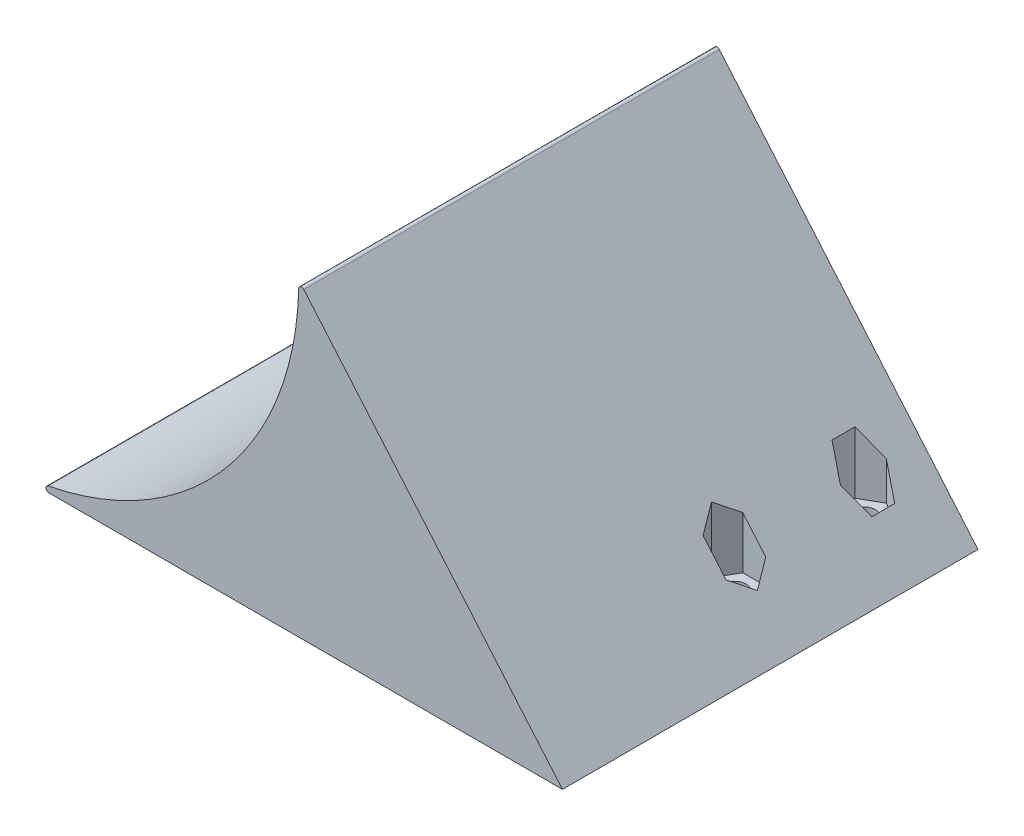
ISO-10303-21;
HEADER;
FILE_DESCRIPTION(('STEP AP214'),'2;1');
FILE_NAME('part.step','',(''),(''),'','','');
FILE_SCHEMA(('AUTOMOTIVE_DESIGN { 1 0 10303 214 1 1 1 1 }'));
ENDSEC;
DATA;
#1=APPLICATION_CONTEXT('core data for automotive mechanical design processes');
#2=APPLICATION_PROTOCOL_DEFINITION('international standard','automotive_design',2000,#1);
#3=PRODUCT_CONTEXT('',#1,'mechanical');
#4=PRODUCT('Part','Part','',(#3));
#5=PRODUCT_RELATED_PRODUCT_CATEGORY('part','',(#4));
#6=PRODUCT_DEFINITION_FORMATION('','',#4);
#7=PRODUCT_DEFINITION_CONTEXT('part definition',#1,'design');
#8=PRODUCT_DEFINITION('design','',#6,#7);
#9=PRODUCT_DEFINITION_SHAPE('','',#8);
#10=(LENGTH_UNIT() NAMED_UNIT(*) SI_UNIT(.MILLI.,.METRE.));
#11=(NAMED_UNIT(*) PLANE_ANGLE_UNIT() SI_UNIT($,.RADIAN.));
#12=(NAMED_UNIT(*) SI_UNIT($,.STERADIAN.) SOLID_ANGLE_UNIT());
#13=UNCERTAINTY_MEASURE_WITH_UNIT(LENGTH_MEASURE(1.E-05),#10,'distance_accuracy_value','');
#14=(GEOMETRIC_REPRESENTATION_CONTEXT(3) GLOBAL_UNCERTAINTY_ASSIGNED_CONTEXT((#13)) GLOBAL_UNIT_ASSIGNED_CONTEXT((#10,
#11,#12)) REPRESENTATION_CONTEXT('',''));
#15=CARTESIAN_POINT('',(0.,0.,0.));
#16=DIRECTION('',(0.,0.,1.));
#17=DIRECTION('',(1.,0.,0.));
#18=AXIS2_PLACEMENT_3D('',#15,#16,#17);
#19=CARTESIAN_POINT('',(0.,-54.,72.5));
#20=DIRECTION('',(0.,-1.,0.));
#21=DIRECTION('',(1.,0.,0.));
#22=AXIS2_PLACEMENT_3D('',#19,#20,#21);
#23=PLANE('',#22);
#24=CARTESIAN_POINT('',(29.8923048454133,-54.,-62.5));
#25=DIRECTION('',(0.,-1.,0.));
#26=DIRECTION('',(1.,0.,0.));
#27=AXIS2_PLACEMENT_3D('',#24,#25,#26);
#28=CIRCLE('',#27,2.04999999999999);
#29=CARTESIAN_POINT('',(31.9423048454133,-54.,-62.5));
#30=VERTEX_POINT('',#29);
#31=EDGE_CURVE('E424',#30,#30,#28,.T.);
#32=ORIENTED_EDGE('',*,*,#31,.F.);
#33=EDGE_LOOP('',(#32));
#34=FACE_BOUND('',#33,.T.);
#35=CARTESIAN_POINT('',(90.,-54.,-62.5));
#36=DIRECTION('',(0.,1.,0.));
#37=DIRECTION('',(-1.,0.,0.));
#38=AXIS2_PLACEMENT_3D('',#35,#36,#37);
#39=CIRCLE('',#38,2.04999999999999);
#40=CARTESIAN_POINT('',(87.95,-54.,-62.5));
#41=VERTEX_POINT('',#40);
#42=EDGE_CURVE('E416',#41,#41,#39,.T.);
#43=ORIENTED_EDGE('',*,*,#42,.T.);
#44=EDGE_LOOP('',(#43));
#45=FACE_BOUND('',#44,.T.);
#46=CARTESIAN_POINT('',(90.,-54.,-40.));
#47=DIRECTION('',(0.,1.,0.));
#48=DIRECTION('',(-1.,0.,0.));
#49=AXIS2_PLACEMENT_3D('',#46,#47,#48);
#50=CIRCLE('',#49,2.04999999999999);
#51=CARTESIAN_POINT('',(87.95,-54.,-40.));
#52=VERTEX_POINT('',#51);
#53=EDGE_CURVE('E433',#52,#52,#50,.T.);
#54=ORIENTED_EDGE('',*,*,#53,.T.);
#55=EDGE_LOOP('',(#54));
#56=FACE_BOUND('',#55,.T.);
#57=DIRECTION('',(0.,0.,-1.));
#58=VECTOR('',#57,1.);
#59=CARTESIAN_POINT('',(100.,-54.,72.5));
#60=LINE('',#59,#58);
#61=CARTESIAN_POINT('',(100.,-54.,0.));
#62=VERTEX_POINT('',#61);
#63=CARTESIAN_POINT('',(100.,-54.,-72.5));
#64=VERTEX_POINT('',#63);
#65=EDGE_CURVE('E207',#62,#64,#60,.T.);
#66=ORIENTED_EDGE('',*,*,#65,.F.);
#67=DIRECTION('',(-1.,0.,0.));
#68=VECTOR('',#67,1.);
#69=CARTESIAN_POINT('',(0.,-54.,0.));
#70=LINE('',#69,#68);
#71=CARTESIAN_POINT('',(10.3923048454133,-54.,0.));
#72=VERTEX_POINT('',#71);
#73=EDGE_CURVE('E196',#62,#72,#70,.T.);
#74=ORIENTED_EDGE('',*,*,#73,.T.);
#75=DIRECTION('',(0.,0.,-1.));
#76=VECTOR('',#75,1.);
#77=CARTESIAN_POINT('',(10.3923048454133,-54.,72.5));
#78=LINE('',#77,#76);
#79=CARTESIAN_POINT('',(10.3923048454133,-54.,-72.5));
#80=VERTEX_POINT('',#79);
#81=EDGE_CURVE('E205',#72,#80,#78,.T.);
#82=ORIENTED_EDGE('',*,*,#81,.T.);
#83=DIRECTION('',(-1.,0.,0.));
#84=VECTOR('',#83,1.);
#85=CARTESIAN_POINT('',(0.,-54.,-72.5));
#86=LINE('',#85,#84);
#87=EDGE_CURVE('E383',#64,#80,#86,.T.);
#88=ORIENTED_EDGE('',*,*,#87,.F.);
#89=EDGE_LOOP('',(#66,#74,#82,#88));
#90=FACE_BOUND('',#89,.T.);
#91=ADVANCED_FACE('F42',(#34,#45,#56,#90),#23,.T.);
#92=CARTESIAN_POINT('',(0.,0.,72.5));
#93=DIRECTION('',(0.,0.,-1.));
#94=DIRECTION('',(-1.,0.,0.));
#95=AXIS2_PLACEMENT_3D('',#92,#93,#94);
#96=CYLINDRICAL_SURFACE('',#95,54.);
#97=CARTESIAN_POINT('',(0.,0.,-83.7583302491976));
#98=DIRECTION('',(0.499999999999997,0.,-0.86602540378444));
#99=DIRECTION('',(-0.866025403784441,0.,-0.499999999999997));
#100=AXIS2_PLACEMENT_3D('',#97,#98,#99);
#101=ELLIPSE('',#100,62.3538290724794,54.);
#102=CARTESIAN_POINT('',(33.356406460551,-42.4658703906856,-64.5));
#103=VERTEX_POINT('',#102);
#104=CARTESIAN_POINT('',(29.8923048454133,-44.9716589757247,-66.5));
#105=VERTEX_POINT('',#104);
#106=EDGE_CURVE('E51',#103,#105,#101,.T.);
#107=ORIENTED_EDGE('',*,*,#106,.F.);
#108=DIRECTION('',(0.,0.,-1.));
#109=VECTOR('',#108,1.);
#110=CARTESIAN_POINT('',(33.356406460551,-42.4658703906856,72.5));
#111=LINE('',#110,#109);
#112=CARTESIAN_POINT('',(33.356406460551,-42.4658703906856,-60.5));
#113=VERTEX_POINT('',#112);
#114=EDGE_CURVE('E260',#113,#103,#111,.T.);
#115=ORIENTED_EDGE('',*,*,#114,.F.);
#116=CARTESIAN_POINT('',(0.,0.,-41.2416697508023));
#117=DIRECTION('',(0.5,0.,0.866025403784439));
#118=DIRECTION('',(0.866025403784439,0.,-0.5));
#119=AXIS2_PLACEMENT_3D('',#116,#117,#118);
#120=ELLIPSE('',#119,62.3538290724796,54.);
#121=CARTESIAN_POINT('',(29.8923048454133,-44.9716589757247,-58.5));
#122=VERTEX_POINT('',#121);
#123=EDGE_CURVE('E263',#122,#113,#120,.T.);
#124=ORIENTED_EDGE('',*,*,#123,.F.);
#125=CARTESIAN_POINT('',(0.,0.,-75.7583302491976));
#126=DIRECTION('',(-0.499999999999998,0.,0.86602540378444));
#127=DIRECTION('',(-0.86602540378444,0.,-0.499999999999998));
#128=AXIS2_PLACEMENT_3D('',#125,#126,#127);
#129=ELLIPSE('',#128,62.3538290724795,54.);
#130=CARTESIAN_POINT('',(26.4282032302755,-47.0908703892724,-60.5));
#131=VERTEX_POINT('',#130);
#132=EDGE_CURVE('E266',#131,#122,#129,.T.);
#133=ORIENTED_EDGE('',*,*,#132,.F.);
#134=DIRECTION('',(0.,0.,-1.));
#135=VECTOR('',#134,1.);
#136=CARTESIAN_POINT('',(26.4282032302753,-47.0908703892726,72.5));
#137=LINE('',#136,#135);
#138=CARTESIAN_POINT('',(26.4282032302755,-47.0908703892726,-64.5));
#139=VERTEX_POINT('',#138);
#140=EDGE_CURVE('E269',#139,#131,#137,.F.);
#141=ORIENTED_EDGE('',*,*,#140,.F.);
#142=CARTESIAN_POINT('',(0.,0.,-49.2416697508023));
#143=DIRECTION('',(-0.500000000000001,0.,-0.866025403784438));
#144=DIRECTION('',(0.866025403784438,0.,-0.500000000000001));
#145=AXIS2_PLACEMENT_3D('',#142,#143,#144);
#146=ELLIPSE('',#145,62.3538290724796,54.);
#147=EDGE_CURVE('E272',#105,#139,#146,.T.);
#148=ORIENTED_EDGE('',*,*,#147,.F.);
#149=EDGE_LOOP('',(#107,#115,#124,#133,#141,#148));
#150=FACE_BOUND('',#149,.T.);
#151=DIRECTION('',(0.,0.,-1.));
#152=VECTOR('',#151,1.);
#153=CARTESIAN_POINT('',(10.2969625991251,-53.0091743119266,72.5));
#154=LINE('',#153,#152);
#155=CARTESIAN_POINT('',(10.2969625991251,-53.0091743119266,-72.5));
#156=VERTEX_POINT('',#155);
#157=CARTESIAN_POINT('',(10.2969625991251,-53.0091743119266,0.));
#158=VERTEX_POINT('',#157);
#159=EDGE_CURVE('E392',#156,#158,#154,.F.);
#160=ORIENTED_EDGE('',*,*,#159,.T.);
#161=CARTESIAN_POINT('',(0.,0.,0.));
#162=DIRECTION('',(0.,0.,1.));
#163=DIRECTION('',(1.,0.,0.));
#164=AXIS2_PLACEMENT_3D('',#161,#162,#163);
#165=CIRCLE('',#164,54.);
#166=CARTESIAN_POINT('',(53.9837068706725,-1.32642093669479,0.));
#167=VERTEX_POINT('',#166);
#168=EDGE_CURVE('E58',#158,#167,#165,.T.);
#169=ORIENTED_EDGE('',*,*,#168,.T.);
#170=DIRECTION('',(0.,0.,-1.));
#171=VECTOR('',#170,1.);
#172=CARTESIAN_POINT('',(53.9837068706725,-1.32642093669479,72.5));
#173=LINE('',#172,#171);
#174=CARTESIAN_POINT('',(53.9837068706725,-1.32642093669479,-72.5));
#175=VERTEX_POINT('',#174);
#176=EDGE_CURVE('E395',#167,#175,#173,.T.);
#177=ORIENTED_EDGE('',*,*,#176,.T.);
#178=CARTESIAN_POINT('',(0.,0.,-72.5));
#179=DIRECTION('',(0.,0.,1.));
#180=DIRECTION('',(1.,0.,0.));
#181=AXIS2_PLACEMENT_3D('',#178,#179,#180);
#182=CIRCLE('',#181,54.);
#183=EDGE_CURVE('E330',#156,#175,#182,.T.);
#184=ORIENTED_EDGE('',*,*,#183,.F.);
#185=EDGE_LOOP('',(#160,#169,#177,#184));
#186=FACE_BOUND('',#185,.T.);
#187=ADVANCED_FACE('F298',(#150,#186),#96,.F.);
#188=CARTESIAN_POINT('',(31.2925278219396,26.6565977742448,72.5));
#189=DIRECTION('',(0.761243230486711,0.648466455599791,0.));
#190=DIRECTION('',(-0.648466455599791,0.761243230486711,0.));
#191=AXIS2_PLACEMENT_3D('',#188,#189,#190);
#192=PLANE('',#191);
#193=DIRECTION('',(-0.431207891910267,0.506200568764226,-0.746873977413243));
#194=VECTOR('',#193,1.);
#195=CARTESIAN_POINT('',(102.503575987853,-56.9389805074797,-25.2713743430158));
#196=LINE('',#195,#194);
#197=CARTESIAN_POINT('',(94.,-46.9565217391304,-40.));
#198=VERTEX_POINT('',#197);
#199=CARTESIAN_POINT('',(92.,-44.6086956521739,-43.4641016151377));
#200=VERTEX_POINT('',#199);
#201=EDGE_CURVE('E238',#198,#200,#196,.T.);
#202=ORIENTED_EDGE('',*,*,#201,.F.);
#203=DIRECTION('',(0.431207891910267,-0.506200568764227,-0.746873977413242));
#204=VECTOR('',#203,1.);
#205=CARTESIAN_POINT('',(30.0405364901778,28.1263267289217,70.7810404238582));
#206=LINE('',#205,#204);
#207=CARTESIAN_POINT('',(92.,-44.6086956521739,-36.5358983848623));
#208=VERTEX_POINT('',#207);
#209=EDGE_CURVE('E214',#208,#198,#206,.T.);
#210=ORIENTED_EDGE('',*,*,#209,.F.);
#211=DIRECTION('',(0.648466455599791,-0.761243230486711,0.));
#212=VECTOR('',#211,1.);
#213=CARTESIAN_POINT('',(31.2925278219396,26.6565977742448,-36.5358983848623));
#214=LINE('',#213,#212);
#215=CARTESIAN_POINT('',(88.,-39.9130434782609,-36.5358983848623));
#216=VERTEX_POINT('',#215);
#217=EDGE_CURVE('E219',#216,#208,#214,.T.);
#218=ORIENTED_EDGE('',*,*,#217,.F.);
#219=DIRECTION('',(0.431207891910262,-0.50620056876422,0.74687397741325));
#220=VECTOR('',#219,1.);
#221=CARTESIAN_POINT('',(98.041010082757,-51.700316184106,-19.1443587622157));
#222=LINE('',#221,#220);
#223=CARTESIAN_POINT('',(86.,-37.5652173913044,-40.));
#224=VERTEX_POINT('',#223);
#225=EDGE_CURVE('E229',#224,#216,#222,.T.);
#226=ORIENTED_EDGE('',*,*,#225,.F.);
#227=DIRECTION('',(-0.431207891910262,0.50620056876422,0.74687397741325));
#228=VECTOR('',#227,1.);
#229=CARTESIAN_POINT('',(25.5779705850819,33.3649910522951,64.6540248430604));
#230=LINE('',#229,#228);
#231=CARTESIAN_POINT('',(88.,-39.9130434782609,-43.4641016151378));
#232=VERTEX_POINT('',#231);
#233=EDGE_CURVE('E232',#232,#224,#230,.T.);
#234=ORIENTED_EDGE('',*,*,#233,.F.);
#235=DIRECTION('',(-0.648466455599791,0.761243230486711,0.));
#236=VECTOR('',#235,1.);
#237=CARTESIAN_POINT('',(31.2925278219396,26.6565977742448,-43.4641016151377));
#238=LINE('',#237,#236);
#239=EDGE_CURVE('E235',#200,#232,#238,.T.);
#240=ORIENTED_EDGE('',*,*,#239,.F.);
#241=EDGE_LOOP('',(#202,#210,#218,#226,#234,#240));
#242=FACE_BOUND('',#241,.T.);
#243=DIRECTION('',(0.,0.,1.));
#244=VECTOR('',#243,1.);
#245=CARTESIAN_POINT('',(86.5358983848627,-38.1943154952736,72.4999999999995));
#246=LINE('',#245,#244);
#247=CARTESIAN_POINT('',(86.5358983848622,-38.194315495273,-64.5));
#248=VERTEX_POINT('',#247);
#249=CARTESIAN_POINT('',(86.5358983848623,-38.194315495273,-60.5));
#250=VERTEX_POINT('',#249);
#251=EDGE_CURVE('E257',#248,#250,#246,.T.);
#252=ORIENTED_EDGE('',*,*,#251,.F.);
#253=DIRECTION('',(-0.607299313704329,0.712916585652908,0.350624422245871));
#254=VECTOR('',#253,1.);
#255=CARTESIAN_POINT('',(8.91205486141126,52.9293269018215,-19.683853046202));
#256=LINE('',#255,#254);
#257=CARTESIAN_POINT('',(90.,-42.2608695652174,-66.5));
#258=VERTEX_POINT('',#257);
#259=EDGE_CURVE('E241',#258,#248,#256,.T.);
#260=ORIENTED_EDGE('',*,*,#259,.F.);
#261=DIRECTION('',(-0.60729931370433,0.712916585652909,-0.350624422245868));
#262=VECTOR('',#261,1.);
#263=CARTESIAN_POINT('',(68.1076987988256,-16.561211633404,-79.1395259916784));
#264=LINE('',#263,#262);
#265=CARTESIAN_POINT('',(93.4641016151378,-46.3274236351617,-64.5));
#266=VERTEX_POINT('',#265);
#267=EDGE_CURVE('E244',#266,#258,#264,.T.);
#268=ORIENTED_EDGE('',*,*,#267,.F.);
#269=DIRECTION('',(0.,0.,-1.));
#270=VECTOR('',#269,1.);
#271=CARTESIAN_POINT('',(93.4641016151378,-46.3274236351617,72.5));
#272=LINE('',#271,#270);
#273=CARTESIAN_POINT('',(93.4641016151378,-46.3274236351617,-60.5));
#274=VERTEX_POINT('',#273);
#275=EDGE_CURVE('E248',#274,#266,#272,.T.);
#276=ORIENTED_EDGE('',*,*,#275,.F.);
#277=DIRECTION('',(0.607299313704329,-0.712916585652908,-0.35062442224587));
#278=VECTOR('',#277,1.);
#279=CARTESIAN_POINT('',(10.6155266293944,50.9295991741891,-12.6673529300042));
#280=LINE('',#279,#278);
#281=CARTESIAN_POINT('',(90.,-42.2608695652174,-58.5));
#282=VERTEX_POINT('',#281);
#283=EDGE_CURVE('E251',#282,#274,#280,.T.);
#284=ORIENTED_EDGE('',*,*,#283,.F.);
#285=DIRECTION('',(0.607299313704329,-0.712916585652908,0.350624422245871));
#286=VECTOR('',#285,1.);
#287=CARTESIAN_POINT('',(66.4042270308427,-14.5614839057719,-72.1230258754803));
#288=LINE('',#287,#286);
#289=EDGE_CURVE('E254',#250,#282,#288,.T.);
#290=ORIENTED_EDGE('',*,*,#289,.F.);
#291=EDGE_LOOP('',(#252,#260,#268,#276,#284,#290));
#292=FACE_BOUND('',#291,.T.);
#293=DIRECTION('',(0.,0.,-1.));
#294=VECTOR('',#293,1.);
#295=CARTESIAN_POINT('',(54.8641776236073,-1.01446938423466,72.5));
#296=LINE('',#295,#294);
#297=CARTESIAN_POINT('',(54.8641776236073,-1.01446938423466,-72.5));
#298=VERTEX_POINT('',#297);
#299=CARTESIAN_POINT('',(54.8641776236073,-1.01446938423466,0.));
#300=VERTEX_POINT('',#299);
#301=EDGE_CURVE('E215',#298,#300,#296,.F.);
#302=ORIENTED_EDGE('',*,*,#301,.T.);
#303=DIRECTION('',(0.648466455599791,-0.761243230486711,0.));
#304=VECTOR('',#303,1.);
#305=CARTESIAN_POINT('',(31.2925278219396,26.6565977742448,0.));
#306=LINE('',#305,#304);
#307=EDGE_CURVE('E413',#300,#62,#306,.T.);
#308=ORIENTED_EDGE('',*,*,#307,.T.);
#309=ORIENTED_EDGE('',*,*,#65,.T.);
#310=DIRECTION('',(0.648466455599791,-0.761243230486711,0.));
#311=VECTOR('',#310,1.);
#312=CARTESIAN_POINT('',(31.2925278219396,26.6565977742448,-72.5));
#313=LINE('',#312,#311);
#314=EDGE_CURVE('E386',#298,#64,#313,.T.);
#315=ORIENTED_EDGE('',*,*,#314,.F.);
#316=EDGE_LOOP('',(#302,#308,#309,#315));
#317=FACE_BOUND('',#316,.T.);
#318=ADVANCED_FACE('F409',(#242,#292,#317),#192,.T.);
#319=CARTESIAN_POINT('',(54.4835560083639,-1.33870261203456,72.5));
#320=DIRECTION('',(0.,0.,-1.));
#321=DIRECTION('',(-1.,0.,0.));
#322=AXIS2_PLACEMENT_3D('',#319,#320,#321);
#323=CYLINDRICAL_SURFACE('',#322,0.5);
#324=ORIENTED_EDGE('',*,*,#176,.F.);
#325=CARTESIAN_POINT('',(54.4835560083639,-1.33870261203456,0.));
#326=DIRECTION('',(0.,0.,1.));
#327=DIRECTION('',(1.,0.,0.));
#328=AXIS2_PLACEMENT_3D('',#325,#326,#327);
#329=CIRCLE('',#328,0.5);
#330=EDGE_CURVE('E209',#167,#300,#329,.F.);
#331=ORIENTED_EDGE('',*,*,#330,.T.);
#332=ORIENTED_EDGE('',*,*,#301,.F.);
#333=CARTESIAN_POINT('',(54.4835560083639,-1.33870261203456,-72.5));
#334=DIRECTION('',(0.,0.,1.));
#335=DIRECTION('',(1.,0.,0.));
#336=AXIS2_PLACEMENT_3D('',#333,#334,#335);
#337=CIRCLE('',#336,0.5);
#338=EDGE_CURVE('E222',#175,#298,#337,.F.);
#339=ORIENTED_EDGE('',*,*,#338,.F.);
#340=EDGE_LOOP('',(#324,#331,#332,#339));
#341=FACE_BOUND('',#340,.T.);
#342=ADVANCED_FACE('F411',(#341),#323,.T.);
#343=CARTESIAN_POINT('',(10.3923048454133,-53.5,72.5));
#344=DIRECTION('',(0.,0.,-1.));
#345=DIRECTION('',(-1.,0.,0.));
#346=AXIS2_PLACEMENT_3D('',#343,#344,#345);
#347=CYLINDRICAL_SURFACE('',#346,0.5);
#348=ORIENTED_EDGE('',*,*,#81,.F.);
#349=CARTESIAN_POINT('',(10.3923048454133,-53.5,0.));
#350=DIRECTION('',(0.,0.,1.));
#351=DIRECTION('',(1.,0.,0.));
#352=AXIS2_PLACEMENT_3D('',#349,#350,#351);
#353=CIRCLE('',#352,0.5);
#354=EDGE_CURVE('E12',#72,#158,#353,.F.);
#355=ORIENTED_EDGE('',*,*,#354,.T.);
#356=ORIENTED_EDGE('',*,*,#159,.F.);
#357=CARTESIAN_POINT('',(10.3923048454133,-53.5,-72.5));
#358=DIRECTION('',(0.,0.,1.));
#359=DIRECTION('',(1.,0.,0.));
#360=AXIS2_PLACEMENT_3D('',#357,#358,#359);
#361=CIRCLE('',#360,0.5);
#362=EDGE_CURVE('E211',#80,#156,#361,.F.);
#363=ORIENTED_EDGE('',*,*,#362,.F.);
#364=EDGE_LOOP('',(#348,#355,#356,#363));
#365=FACE_BOUND('',#364,.T.);
#366=ADVANCED_FACE('F44',(#365),#347,.T.);
#367=CARTESIAN_POINT('',(0.,0.,-72.5));
#368=DIRECTION('',(0.,0.,1.));
#369=DIRECTION('',(1.,0.,0.));
#370=AXIS2_PLACEMENT_3D('',#367,#368,#369);
#371=PLANE('',#370);
#372=ORIENTED_EDGE('',*,*,#183,.T.);
#373=ORIENTED_EDGE('',*,*,#338,.T.);
#374=ORIENTED_EDGE('',*,*,#314,.T.);
#375=ORIENTED_EDGE('',*,*,#87,.T.);
#376=ORIENTED_EDGE('',*,*,#362,.T.);
#377=EDGE_LOOP('',(#372,#373,#374,#375,#376));
#378=FACE_BOUND('',#377,.T.);
#379=ADVANCED_FACE('F403',(#378),#371,.F.);
#380=CARTESIAN_POINT('',(0.,-49.,72.5));
#381=DIRECTION('',(0.,-1.,0.));
#382=DIRECTION('',(1.,0.,0.));
#383=AXIS2_PLACEMENT_3D('',#380,#381,#382);
#384=PLANE('',#383);
#385=CARTESIAN_POINT('',(90.,-49.,-40.));
#386=DIRECTION('',(0.,1.,0.));
#387=DIRECTION('',(-1.,0.,0.));
#388=AXIS2_PLACEMENT_3D('',#385,#386,#387);
#389=CIRCLE('',#388,2.04999999999999);
#390=CARTESIAN_POINT('',(87.95,-49.,-40.));
#391=VERTEX_POINT('',#390);
#392=EDGE_CURVE('E428',#391,#391,#389,.T.);
#393=ORIENTED_EDGE('',*,*,#392,.F.);
#394=EDGE_LOOP('',(#393));
#395=FACE_BOUND('',#394,.T.);
#396=DIRECTION('',(0.500000000000005,0.,-0.866025403784436));
#397=VECTOR('',#396,1.);
#398=CARTESIAN_POINT('',(92.,-49.,-36.5358983848623));
#399=LINE('',#398,#397);
#400=CARTESIAN_POINT('',(92.,-49.,-36.5358983848623));
#401=VERTEX_POINT('',#400);
#402=CARTESIAN_POINT('',(94.,-49.,-40.));
#403=VERTEX_POINT('',#402);
#404=EDGE_CURVE('E448',#401,#403,#399,.T.);
#405=ORIENTED_EDGE('',*,*,#404,.T.);
#406=DIRECTION('',(-0.500000000000003,0.,-0.866025403784437));
#407=VECTOR('',#406,1.);
#408=CARTESIAN_POINT('',(94.,-49.,-40.));
#409=LINE('',#408,#407);
#410=CARTESIAN_POINT('',(92.,-49.,-43.4641016151377));
#411=VERTEX_POINT('',#410);
#412=EDGE_CURVE('E432',#403,#411,#409,.T.);
#413=ORIENTED_EDGE('',*,*,#412,.T.);
#414=DIRECTION('',(-1.,0.,0.));
#415=VECTOR('',#414,1.);
#416=CARTESIAN_POINT('',(92.,-49.,-43.4641016151377));
#417=LINE('',#416,#415);
#418=CARTESIAN_POINT('',(88.,-49.,-43.4641016151377));
#419=VERTEX_POINT('',#418);
#420=EDGE_CURVE('E468',#411,#419,#417,.T.);
#421=ORIENTED_EDGE('',*,*,#420,.T.);
#422=DIRECTION('',(-0.499999999999996,0.,0.866025403784441));
#423=VECTOR('',#422,1.);
#424=CARTESIAN_POINT('',(88.,-49.,-43.4641016151377));
#425=LINE('',#424,#423);
#426=CARTESIAN_POINT('',(86.,-49.,-40.));
#427=VERTEX_POINT('',#426);
#428=EDGE_CURVE('E463',#419,#427,#425,.T.);
#429=ORIENTED_EDGE('',*,*,#428,.T.);
#430=DIRECTION('',(0.499999999999996,0.,0.866025403784441));
#431=VECTOR('',#430,1.);
#432=CARTESIAN_POINT('',(86.,-49.,-40.));
#433=LINE('',#432,#431);
#434=CARTESIAN_POINT('',(88.,-49.,-36.5358983848623));
#435=VERTEX_POINT('',#434);
#436=EDGE_CURVE('E458',#427,#435,#433,.T.);
#437=ORIENTED_EDGE('',*,*,#436,.T.);
#438=DIRECTION('',(1.,0.,0.));
#439=VECTOR('',#438,1.);
#440=CARTESIAN_POINT('',(88.,-49.,-36.5358983848623));
#441=LINE('',#440,#439);
#442=EDGE_CURVE('E453',#435,#401,#441,.T.);
#443=ORIENTED_EDGE('',*,*,#442,.T.);
#444=EDGE_LOOP('',(#405,#413,#421,#429,#437,#443));
#445=FACE_BOUND('',#444,.T.);
#446=ADVANCED_FACE('F581',(#395,#445),#384,.F.);
#447=CARTESIAN_POINT('',(94.,-64.5830052442584,-40.));
#448=DIRECTION('',(0.866025403784437,0.,-0.500000000000003));
#449=DIRECTION('',(-0.500000000000003,0.,-0.866025403784437));
#450=AXIS2_PLACEMENT_3D('',#447,#448,#449);
#451=PLANE('',#450);
#452=ORIENTED_EDGE('',*,*,#201,.T.);
#453=DIRECTION('',(0.,1.,0.));
#454=VECTOR('',#453,1.);
#455=CARTESIAN_POINT('',(92.,-64.5830052442584,-43.4641016151377));
#456=LINE('',#455,#454);
#457=EDGE_CURVE('E447',#411,#200,#456,.T.);
#458=ORIENTED_EDGE('',*,*,#457,.F.);
#459=ORIENTED_EDGE('',*,*,#412,.F.);
#460=DIRECTION('',(0.,1.,0.));
#461=VECTOR('',#460,1.);
#462=CARTESIAN_POINT('',(94.,-64.5830052442584,-40.));
#463=LINE('',#462,#461);
#464=EDGE_CURVE('E337',#403,#198,#463,.T.);
#465=ORIENTED_EDGE('',*,*,#464,.T.);
#466=EDGE_LOOP('',(#452,#458,#459,#465));
#467=FACE_BOUND('',#466,.T.);
#468=ADVANCED_FACE('F585',(#467),#451,.F.);
#469=CARTESIAN_POINT('',(92.,-64.5830052442584,-43.4641016151377));
#470=DIRECTION('',(0.,0.,-1.));
#471=DIRECTION('',(-1.,0.,0.));
#472=AXIS2_PLACEMENT_3D('',#469,#470,#471);
#473=PLANE('',#472);
#474=ORIENTED_EDGE('',*,*,#239,.T.);
#475=DIRECTION('',(0.,1.,0.));
#476=VECTOR('',#475,1.);
#477=CARTESIAN_POINT('',(88.,-64.5830052442584,-43.4641016151377));
#478=LINE('',#477,#476);
#479=EDGE_CURVE('E467',#419,#232,#478,.T.);
#480=ORIENTED_EDGE('',*,*,#479,.F.);
#481=ORIENTED_EDGE('',*,*,#420,.F.);
#482=ORIENTED_EDGE('',*,*,#457,.T.);
#483=EDGE_LOOP('',(#474,#480,#481,#482));
#484=FACE_BOUND('',#483,.T.);
#485=ADVANCED_FACE('F591',(#484),#473,.F.);
#486=CARTESIAN_POINT('',(88.,-64.5830052442584,-43.4641016151377));
#487=DIRECTION('',(-0.866025403784441,0.,-0.499999999999996));
#488=DIRECTION('',(-0.499999999999996,0.,0.866025403784441));
#489=AXIS2_PLACEMENT_3D('',#486,#487,#488);
#490=PLANE('',#489);
#491=ORIENTED_EDGE('',*,*,#233,.T.);
#492=DIRECTION('',(0.,1.,0.));
#493=VECTOR('',#492,1.);
#494=CARTESIAN_POINT('',(86.,-64.5830052442584,-40.));
#495=LINE('',#494,#493);
#496=EDGE_CURVE('E462',#427,#224,#495,.T.);
#497=ORIENTED_EDGE('',*,*,#496,.F.);
#498=ORIENTED_EDGE('',*,*,#428,.F.);
#499=ORIENTED_EDGE('',*,*,#479,.T.);
#500=EDGE_LOOP('',(#491,#497,#498,#499));
#501=FACE_BOUND('',#500,.T.);
#502=ADVANCED_FACE('F694',(#501),#490,.F.);
#503=CARTESIAN_POINT('',(86.,-64.5830052442584,-40.));
#504=DIRECTION('',(-0.866025403784441,0.,0.499999999999996));
#505=DIRECTION('',(0.499999999999996,0.,0.866025403784441));
#506=AXIS2_PLACEMENT_3D('',#503,#504,#505);
#507=PLANE('',#506);
#508=ORIENTED_EDGE('',*,*,#225,.T.);
#509=DIRECTION('',(0.,1.,0.));
#510=VECTOR('',#509,1.);
#511=CARTESIAN_POINT('',(88.,-64.5830052442584,-36.5358983848623));
#512=LINE('',#511,#510);
#513=EDGE_CURVE('E457',#435,#216,#512,.T.);
#514=ORIENTED_EDGE('',*,*,#513,.F.);
#515=ORIENTED_EDGE('',*,*,#436,.F.);
#516=ORIENTED_EDGE('',*,*,#496,.T.);
#517=EDGE_LOOP('',(#508,#514,#515,#516));
#518=FACE_BOUND('',#517,.T.);
#519=ADVANCED_FACE('F690',(#518),#507,.F.);
#520=CARTESIAN_POINT('',(88.,-64.5830052442584,-36.5358983848623));
#521=DIRECTION('',(0.,0.,1.));
#522=DIRECTION('',(1.,0.,0.));
#523=AXIS2_PLACEMENT_3D('',#520,#521,#522);
#524=PLANE('',#523);
#525=ORIENTED_EDGE('',*,*,#217,.T.);
#526=DIRECTION('',(0.,1.,0.));
#527=VECTOR('',#526,1.);
#528=CARTESIAN_POINT('',(92.,-64.5830052442584,-36.5358983848623));
#529=LINE('',#528,#527);
#530=EDGE_CURVE('E452',#401,#208,#529,.T.);
#531=ORIENTED_EDGE('',*,*,#530,.F.);
#532=ORIENTED_EDGE('',*,*,#442,.F.);
#533=ORIENTED_EDGE('',*,*,#513,.T.);
#534=EDGE_LOOP('',(#525,#531,#532,#533));
#535=FACE_BOUND('',#534,.T.);
#536=ADVANCED_FACE('F686',(#535),#524,.F.);
#537=CARTESIAN_POINT('',(92.,-64.5830052442584,-36.5358983848623));
#538=DIRECTION('',(0.866025403784436,0.,0.500000000000005));
#539=DIRECTION('',(0.500000000000005,0.,-0.866025403784436));
#540=AXIS2_PLACEMENT_3D('',#537,#538,#539);
#541=PLANE('',#540);
#542=ORIENTED_EDGE('',*,*,#209,.T.);
#543=ORIENTED_EDGE('',*,*,#464,.F.);
#544=ORIENTED_EDGE('',*,*,#404,.F.);
#545=ORIENTED_EDGE('',*,*,#530,.T.);
#546=EDGE_LOOP('',(#542,#543,#544,#545));
#547=FACE_BOUND('',#546,.T.);
#548=ADVANCED_FACE('F578',(#547),#541,.F.);
#549=CARTESIAN_POINT('',(0.,-49.,72.5));
#550=DIRECTION('',(0.,-1.,0.));
#551=DIRECTION('',(1.,0.,0.));
#552=AXIS2_PLACEMENT_3D('',#549,#550,#551);
#553=PLANE('',#552);
#554=CARTESIAN_POINT('',(90.,-49.,-62.5));
#555=DIRECTION('',(0.,1.,0.));
#556=DIRECTION('',(-1.,0.,0.));
#557=AXIS2_PLACEMENT_3D('',#554,#555,#556);
#558=CIRCLE('',#557,2.04999999999999);
#559=CARTESIAN_POINT('',(87.95,-49.,-62.5));
#560=VERTEX_POINT('',#559);
#561=EDGE_CURVE('E420',#560,#560,#558,.T.);
#562=ORIENTED_EDGE('',*,*,#561,.F.);
#563=EDGE_LOOP('',(#562));
#564=FACE_BOUND('',#563,.T.);
#565=DIRECTION('',(-0.866025403784438,0.,0.500000000000002));
#566=VECTOR('',#565,1.);
#567=CARTESIAN_POINT('',(86.5358983848623,-49.,-64.5));
#568=LINE('',#567,#566);
#569=CARTESIAN_POINT('',(90.,-49.,-66.5));
#570=VERTEX_POINT('',#569);
#571=CARTESIAN_POINT('',(86.5358983848623,-49.,-64.5));
#572=VERTEX_POINT('',#571);
#573=EDGE_CURVE('E338',#570,#572,#568,.T.);
#574=ORIENTED_EDGE('',*,*,#573,.T.);
#575=DIRECTION('',(0.,0.,1.));
#576=VECTOR('',#575,1.);
#577=CARTESIAN_POINT('',(86.5358983848623,-49.,-60.5));
#578=LINE('',#577,#576);
#579=CARTESIAN_POINT('',(86.5358983848623,-49.,-60.5));
#580=VERTEX_POINT('',#579);
#581=EDGE_CURVE('E332',#572,#580,#578,.T.);
#582=ORIENTED_EDGE('',*,*,#581,.T.);
#583=DIRECTION('',(0.866025403784438,0.,0.500000000000002));
#584=VECTOR('',#583,1.);
#585=CARTESIAN_POINT('',(90.,-49.,-58.5));
#586=LINE('',#585,#584);
#587=CARTESIAN_POINT('',(90.,-49.,-58.5));
#588=VERTEX_POINT('',#587);
#589=EDGE_CURVE('E359',#580,#588,#586,.T.);
#590=ORIENTED_EDGE('',*,*,#589,.T.);
#591=DIRECTION('',(0.866025403784439,0.,-0.5));
#592=VECTOR('',#591,1.);
#593=CARTESIAN_POINT('',(93.4641016151378,-49.,-60.5));
#594=LINE('',#593,#592);
#595=CARTESIAN_POINT('',(93.4641016151378,-49.,-60.5));
#596=VERTEX_POINT('',#595);
#597=EDGE_CURVE('E354',#588,#596,#594,.T.);
#598=ORIENTED_EDGE('',*,*,#597,.T.);
#599=DIRECTION('',(0.,0.,-1.));
#600=VECTOR('',#599,1.);
#601=CARTESIAN_POINT('',(93.4641016151378,-49.,-64.5));
#602=LINE('',#601,#600);
#603=CARTESIAN_POINT('',(93.4641016151378,-49.,-64.5));
#604=VERTEX_POINT('',#603);
#605=EDGE_CURVE('E349',#596,#604,#602,.T.);
#606=ORIENTED_EDGE('',*,*,#605,.T.);
#607=DIRECTION('',(-0.86602540378444,0.,-0.499999999999999));
#608=VECTOR('',#607,1.);
#609=CARTESIAN_POINT('',(90.,-49.,-66.5));
#610=LINE('',#609,#608);
#611=EDGE_CURVE('E344',#604,#570,#610,.T.);
#612=ORIENTED_EDGE('',*,*,#611,.T.);
#613=EDGE_LOOP('',(#574,#582,#590,#598,#606,#612));
#614=FACE_BOUND('',#613,.T.);
#615=ADVANCED_FACE('F555',(#564,#614),#553,.F.);
#616=CARTESIAN_POINT('',(86.5358983848623,-64.5830052442584,-60.5));
#617=DIRECTION('',(-1.,0.,0.));
#618=DIRECTION('',(0.,0.,1.));
#619=AXIS2_PLACEMENT_3D('',#616,#617,#618);
#620=PLANE('',#619);
#621=ORIENTED_EDGE('',*,*,#251,.T.);
#622=DIRECTION('',(0.,1.,0.));
#623=VECTOR('',#622,1.);
#624=CARTESIAN_POINT('',(86.5358983848623,-64.5830052442584,-60.5));
#625=LINE('',#624,#623);
#626=EDGE_CURVE('E336',#580,#250,#625,.T.);
#627=ORIENTED_EDGE('',*,*,#626,.F.);
#628=ORIENTED_EDGE('',*,*,#581,.F.);
#629=DIRECTION('',(0.,1.,0.));
#630=VECTOR('',#629,1.);
#631=CARTESIAN_POINT('',(86.5358983848623,-64.5830052442584,-64.5));
#632=LINE('',#631,#630);
#633=EDGE_CURVE('E342',#572,#248,#632,.T.);
#634=ORIENTED_EDGE('',*,*,#633,.T.);
#635=EDGE_LOOP('',(#621,#627,#628,#634));
#636=FACE_BOUND('',#635,.T.);
#637=ADVANCED_FACE('F549',(#636),#620,.F.);
#638=CARTESIAN_POINT('',(90.,-64.5830052442584,-58.5));
#639=DIRECTION('',(-0.500000000000001,0.,0.866025403784438));
#640=DIRECTION('',(0.866025403784438,0.,0.500000000000002));
#641=AXIS2_PLACEMENT_3D('',#638,#639,#640);
#642=PLANE('',#641);
#643=ORIENTED_EDGE('',*,*,#289,.T.);
#644=DIRECTION('',(0.,1.,0.));
#645=VECTOR('',#644,1.);
#646=CARTESIAN_POINT('',(90.,-64.5830052442584,-58.5));
#647=LINE('',#646,#645);
#648=EDGE_CURVE('E358',#588,#282,#647,.T.);
#649=ORIENTED_EDGE('',*,*,#648,.F.);
#650=ORIENTED_EDGE('',*,*,#589,.F.);
#651=ORIENTED_EDGE('',*,*,#626,.T.);
#652=EDGE_LOOP('',(#643,#649,#650,#651));
#653=FACE_BOUND('',#652,.T.);
#654=ADVANCED_FACE('F552',(#653),#642,.F.);
#655=CARTESIAN_POINT('',(93.4641016151378,-64.5830052442584,-60.5));
#656=DIRECTION('',(0.5,0.,0.866025403784439));
#657=DIRECTION('',(0.866025403784439,0.,-0.5));
#658=AXIS2_PLACEMENT_3D('',#655,#656,#657);
#659=PLANE('',#658);
#660=ORIENTED_EDGE('',*,*,#283,.T.);
#661=DIRECTION('',(0.,1.,0.));
#662=VECTOR('',#661,1.);
#663=CARTESIAN_POINT('',(93.4641016151378,-64.5830052442584,-60.5));
#664=LINE('',#663,#662);
#665=EDGE_CURVE('E353',#596,#274,#664,.T.);
#666=ORIENTED_EDGE('',*,*,#665,.F.);
#667=ORIENTED_EDGE('',*,*,#597,.F.);
#668=ORIENTED_EDGE('',*,*,#648,.T.);
#669=EDGE_LOOP('',(#660,#666,#667,#668));
#670=FACE_BOUND('',#669,.T.);
#671=ADVANCED_FACE('F564',(#670),#659,.F.);
#672=CARTESIAN_POINT('',(93.4641016151378,-64.5830052442584,-64.5));
#673=DIRECTION('',(1.,0.,0.));
#674=DIRECTION('',(0.,0.,-1.));
#675=AXIS2_PLACEMENT_3D('',#672,#673,#674);
#676=PLANE('',#675);
#677=ORIENTED_EDGE('',*,*,#275,.T.);
#678=DIRECTION('',(0.,1.,0.));
#679=VECTOR('',#678,1.);
#680=CARTESIAN_POINT('',(93.4641016151378,-64.5830052442584,-64.5));
#681=LINE('',#680,#679);
#682=EDGE_CURVE('E348',#604,#266,#681,.T.);
#683=ORIENTED_EDGE('',*,*,#682,.F.);
#684=ORIENTED_EDGE('',*,*,#605,.F.);
#685=ORIENTED_EDGE('',*,*,#665,.T.);
#686=EDGE_LOOP('',(#677,#683,#684,#685));
#687=FACE_BOUND('',#686,.T.);
#688=ADVANCED_FACE('F561',(#687),#676,.F.);
#689=CARTESIAN_POINT('',(90.,-64.5830052442584,-66.5));
#690=DIRECTION('',(0.499999999999998,0.,-0.866025403784439));
#691=DIRECTION('',(-0.86602540378444,0.,-0.499999999999999));
#692=AXIS2_PLACEMENT_3D('',#689,#690,#691);
#693=PLANE('',#692);
#694=ORIENTED_EDGE('',*,*,#267,.T.);
#695=DIRECTION('',(0.,1.,0.));
#696=VECTOR('',#695,1.);
#697=CARTESIAN_POINT('',(90.,-64.5830052442584,-66.5));
#698=LINE('',#697,#696);
#699=EDGE_CURVE('E343',#570,#258,#698,.T.);
#700=ORIENTED_EDGE('',*,*,#699,.F.);
#701=ORIENTED_EDGE('',*,*,#611,.F.);
#702=ORIENTED_EDGE('',*,*,#682,.T.);
#703=EDGE_LOOP('',(#694,#700,#701,#702));
#704=FACE_BOUND('',#703,.T.);
#705=ADVANCED_FACE('F515',(#704),#693,.F.);
#706=CARTESIAN_POINT('',(86.5358983848623,-64.5830052442584,-64.5));
#707=DIRECTION('',(-0.500000000000001,0.,-0.866025403784438));
#708=DIRECTION('',(-0.866025403784438,0.,0.500000000000002));
#709=AXIS2_PLACEMENT_3D('',#706,#707,#708);
#710=PLANE('',#709);
#711=ORIENTED_EDGE('',*,*,#259,.T.);
#712=ORIENTED_EDGE('',*,*,#633,.F.);
#713=ORIENTED_EDGE('',*,*,#573,.F.);
#714=ORIENTED_EDGE('',*,*,#699,.T.);
#715=EDGE_LOOP('',(#711,#712,#713,#714));
#716=FACE_BOUND('',#715,.T.);
#717=ADVANCED_FACE('F507',(#716),#710,.F.);
#718=CARTESIAN_POINT('',(0.,-49.,72.5));
#719=DIRECTION('',(0.,-1.,0.));
#720=DIRECTION('',(1.,0.,0.));
#721=AXIS2_PLACEMENT_3D('',#718,#719,#720);
#722=PLANE('',#721);
#723=CARTESIAN_POINT('',(29.8923048454133,-49.,-62.5));
#724=DIRECTION('',(0.,-1.,0.));
#725=DIRECTION('',(1.,0.,0.));
#726=AXIS2_PLACEMENT_3D('',#723,#724,#725);
#727=CIRCLE('',#726,2.04999999999999);
#728=CARTESIAN_POINT('',(31.9423048454133,-49.,-62.5));
#729=VERTEX_POINT('',#728);
#730=EDGE_CURVE('E437',#729,#729,#727,.T.);
#731=ORIENTED_EDGE('',*,*,#730,.T.);
#732=EDGE_LOOP('',(#731));
#733=FACE_BOUND('',#732,.T.);
#734=DIRECTION('',(0.,0.,-1.));
#735=VECTOR('',#734,1.);
#736=CARTESIAN_POINT('',(33.356406460551,-49.,-64.5));
#737=LINE('',#736,#735);
#738=CARTESIAN_POINT('',(33.356406460551,-49.,-60.5));
#739=VERTEX_POINT('',#738);
#740=CARTESIAN_POINT('',(33.356406460551,-49.,-64.5));
#741=VERTEX_POINT('',#740);
#742=EDGE_CURVE('E331',#739,#741,#737,.T.);
#743=ORIENTED_EDGE('',*,*,#742,.T.);
#744=DIRECTION('',(-0.866025403784441,0.,-0.499999999999997));
#745=VECTOR('',#744,1.);
#746=CARTESIAN_POINT('',(29.8923048454133,-49.,-66.5));
#747=LINE('',#746,#745);
#748=CARTESIAN_POINT('',(29.8923048454133,-49.,-66.5));
#749=VERTEX_POINT('',#748);
#750=EDGE_CURVE('E295',#741,#749,#747,.T.);
#751=ORIENTED_EDGE('',*,*,#750,.T.);
#752=DIRECTION('',(-0.866025403784438,0.,0.500000000000001));
#753=VECTOR('',#752,1.);
#754=CARTESIAN_POINT('',(26.4282032302755,-49.,-64.5));
#755=LINE('',#754,#753);
#756=CARTESIAN_POINT('',(26.4282032302755,-49.,-64.5));
#757=VERTEX_POINT('',#756);
#758=EDGE_CURVE('E293',#749,#757,#755,.T.);
#759=ORIENTED_EDGE('',*,*,#758,.T.);
#760=DIRECTION('',(0.,0.,1.));
#761=VECTOR('',#760,1.);
#762=CARTESIAN_POINT('',(26.4282032302755,-49.,-60.5));
#763=LINE('',#762,#761);
#764=CARTESIAN_POINT('',(26.4282032302755,-49.,-60.5));
#765=VERTEX_POINT('',#764);
#766=EDGE_CURVE('E316',#757,#765,#763,.T.);
#767=ORIENTED_EDGE('',*,*,#766,.T.);
#768=DIRECTION('',(0.86602540378444,0.,0.499999999999998));
#769=VECTOR('',#768,1.);
#770=CARTESIAN_POINT('',(29.8923048454133,-49.,-58.5));
#771=LINE('',#770,#769);
#772=CARTESIAN_POINT('',(29.8923048454133,-49.,-58.5));
#773=VERTEX_POINT('',#772);
#774=EDGE_CURVE('E314',#765,#773,#771,.T.);
#775=ORIENTED_EDGE('',*,*,#774,.T.);
#776=DIRECTION('',(0.866025403784439,0.,-0.5));
#777=VECTOR('',#776,1.);
#778=CARTESIAN_POINT('',(33.356406460551,-49.,-60.5));
#779=LINE('',#778,#777);
#780=EDGE_CURVE('E494',#773,#739,#779,.T.);
#781=ORIENTED_EDGE('',*,*,#780,.T.);
#782=EDGE_LOOP('',(#743,#751,#759,#767,#775,#781));
#783=FACE_BOUND('',#782,.T.);
#784=ADVANCED_FACE('F505',(#733,#783),#722,.F.);
#785=CARTESIAN_POINT('',(29.8923048454133,-64.5830052442584,-66.5));
#786=DIRECTION('',(0.499999999999997,0.,-0.86602540378444));
#787=DIRECTION('',(-0.866025403784441,0.,-0.499999999999997));
#788=AXIS2_PLACEMENT_3D('',#785,#786,#787);
#789=PLANE('',#788);
#790=ORIENTED_EDGE('',*,*,#106,.T.);
#791=DIRECTION('',(0.,1.,0.));
#792=VECTOR('',#791,1.);
#793=CARTESIAN_POINT('',(29.8923048454133,-64.5830052442584,-66.5));
#794=LINE('',#793,#792);
#795=EDGE_CURVE('E281',#749,#105,#794,.T.);
#796=ORIENTED_EDGE('',*,*,#795,.F.);
#797=ORIENTED_EDGE('',*,*,#750,.F.);
#798=DIRECTION('',(0.,1.,0.));
#799=VECTOR('',#798,1.);
#800=CARTESIAN_POINT('',(33.356406460551,-64.5830052442584,-64.5));
#801=LINE('',#800,#799);
#802=EDGE_CURVE('E284',#741,#103,#801,.T.);
#803=ORIENTED_EDGE('',*,*,#802,.T.);
#804=EDGE_LOOP('',(#790,#796,#797,#803));
#805=FACE_BOUND('',#804,.T.);
#806=ADVANCED_FACE('F280',(#805),#789,.F.);
#807=CARTESIAN_POINT('',(26.4282032302755,-64.5830052442584,-64.5));
#808=DIRECTION('',(-0.500000000000001,0.,-0.866025403784438));
#809=DIRECTION('',(-0.866025403784438,0.,0.500000000000001));
#810=AXIS2_PLACEMENT_3D('',#807,#808,#809);
#811=PLANE('',#810);
#812=ORIENTED_EDGE('',*,*,#147,.T.);
#813=DIRECTION('',(0.,1.,0.));
#814=VECTOR('',#813,1.);
#815=CARTESIAN_POINT('',(26.4282032302755,-64.5830052442584,-64.5));
#816=LINE('',#815,#814);
#817=EDGE_CURVE('E308',#757,#139,#816,.T.);
#818=ORIENTED_EDGE('',*,*,#817,.F.);
#819=ORIENTED_EDGE('',*,*,#758,.F.);
#820=ORIENTED_EDGE('',*,*,#795,.T.);
#821=EDGE_LOOP('',(#812,#818,#819,#820));
#822=FACE_BOUND('',#821,.T.);
#823=ADVANCED_FACE('F289',(#822),#811,.F.);
#824=CARTESIAN_POINT('',(26.4282032302755,-64.5830052442584,-60.5));
#825=DIRECTION('',(-1.,0.,0.));
#826=DIRECTION('',(0.,0.,1.));
#827=AXIS2_PLACEMENT_3D('',#824,#825,#826);
#828=PLANE('',#827);
#829=ORIENTED_EDGE('',*,*,#140,.T.);
#830=DIRECTION('',(0.,1.,0.));
#831=VECTOR('',#830,1.);
#832=CARTESIAN_POINT('',(26.4282032302755,-64.5830052442584,-60.5));
#833=LINE('',#832,#831);
#834=EDGE_CURVE('E306',#765,#131,#833,.T.);
#835=ORIENTED_EDGE('',*,*,#834,.F.);
#836=ORIENTED_EDGE('',*,*,#766,.F.);
#837=ORIENTED_EDGE('',*,*,#817,.T.);
#838=EDGE_LOOP('',(#829,#835,#836,#837));
#839=FACE_BOUND('',#838,.T.);
#840=ADVANCED_FACE('F305',(#839),#828,.F.);
#841=CARTESIAN_POINT('',(29.8923048454133,-64.5830052442584,-58.5));
#842=DIRECTION('',(-0.499999999999998,0.,0.86602540378444));
#843=DIRECTION('',(0.86602540378444,0.,0.499999999999998));
#844=AXIS2_PLACEMENT_3D('',#841,#842,#843);
#845=PLANE('',#844);
#846=ORIENTED_EDGE('',*,*,#132,.T.);
#847=DIRECTION('',(0.,1.,0.));
#848=VECTOR('',#847,1.);
#849=CARTESIAN_POINT('',(29.8923048454133,-64.5830052442584,-58.5));
#850=LINE('',#849,#848);
#851=EDGE_CURVE('E320',#773,#122,#850,.T.);
#852=ORIENTED_EDGE('',*,*,#851,.F.);
#853=ORIENTED_EDGE('',*,*,#774,.F.);
#854=ORIENTED_EDGE('',*,*,#834,.T.);
#855=EDGE_LOOP('',(#846,#852,#853,#854));
#856=FACE_BOUND('',#855,.T.);
#857=ADVANCED_FACE('F310',(#856),#845,.F.);
#858=CARTESIAN_POINT('',(33.356406460551,-64.5830052442584,-60.5));
#859=DIRECTION('',(0.5,0.,0.866025403784439));
#860=DIRECTION('',(0.866025403784439,0.,-0.5));
#861=AXIS2_PLACEMENT_3D('',#858,#859,#860);
#862=PLANE('',#861);
#863=ORIENTED_EDGE('',*,*,#123,.T.);
#864=DIRECTION('',(0.,1.,0.));
#865=VECTOR('',#864,1.);
#866=CARTESIAN_POINT('',(33.356406460551,-64.5830052442584,-60.5));
#867=LINE('',#866,#865);
#868=EDGE_CURVE('E65',#739,#113,#867,.T.);
#869=ORIENTED_EDGE('',*,*,#868,.F.);
#870=ORIENTED_EDGE('',*,*,#780,.F.);
#871=ORIENTED_EDGE('',*,*,#851,.T.);
#872=EDGE_LOOP('',(#863,#869,#870,#871));
#873=FACE_BOUND('',#872,.T.);
#874=ADVANCED_FACE('F502',(#873),#862,.F.);
#875=CARTESIAN_POINT('',(33.356406460551,-64.5830052442584,-64.5));
#876=DIRECTION('',(1.,0.,0.));
#877=DIRECTION('',(0.,0.,-1.));
#878=AXIS2_PLACEMENT_3D('',#875,#876,#877);
#879=PLANE('',#878);
#880=ORIENTED_EDGE('',*,*,#114,.T.);
#881=ORIENTED_EDGE('',*,*,#802,.F.);
#882=ORIENTED_EDGE('',*,*,#742,.F.);
#883=ORIENTED_EDGE('',*,*,#868,.T.);
#884=EDGE_LOOP('',(#880,#881,#882,#883));
#885=FACE_BOUND('',#884,.T.);
#886=ADVANCED_FACE('F503',(#885),#879,.F.);
#887=CARTESIAN_POINT('',(90.,-54.,-62.5));
#888=DIRECTION('',(0.,1.,0.));
#889=DIRECTION('',(-1.,0.,0.));
#890=AXIS2_PLACEMENT_3D('',#887,#888,#889);
#891=CYLINDRICAL_SURFACE('',#890,2.04999999999999);
#892=ORIENTED_EDGE('',*,*,#42,.F.);
#893=EDGE_LOOP('',(#892));
#894=FACE_BOUND('',#893,.T.);
#895=ORIENTED_EDGE('',*,*,#561,.T.);
#896=EDGE_LOOP('',(#895));
#897=FACE_BOUND('',#896,.T.);
#898=ADVANCED_FACE('F600',(#894,#897),#891,.F.);
#899=CARTESIAN_POINT('',(29.8923048454133,-54.,-62.5));
#900=DIRECTION('',(0.,1.,0.));
#901=DIRECTION('',(-1.,0.,0.));
#902=AXIS2_PLACEMENT_3D('',#899,#900,#901);
#903=CYLINDRICAL_SURFACE('',#902,2.04999999999999);
#904=ORIENTED_EDGE('',*,*,#31,.T.);
#905=EDGE_LOOP('',(#904));
#906=FACE_BOUND('',#905,.T.);
#907=ORIENTED_EDGE('',*,*,#730,.F.);
#908=EDGE_LOOP('',(#907));
#909=FACE_BOUND('',#908,.T.);
#910=ADVANCED_FACE('F634',(#906,#909),#903,.F.);
#911=CARTESIAN_POINT('',(90.,-54.,-40.));
#912=DIRECTION('',(0.,1.,0.));
#913=DIRECTION('',(-1.,0.,0.));
#914=AXIS2_PLACEMENT_3D('',#911,#912,#913);
#915=CYLINDRICAL_SURFACE('',#914,2.04999999999999);
#916=ORIENTED_EDGE('',*,*,#53,.F.);
#917=EDGE_LOOP('',(#916));
#918=FACE_BOUND('',#917,.T.);
#919=ORIENTED_EDGE('',*,*,#392,.T.);
#920=EDGE_LOOP('',(#919));
#921=FACE_BOUND('',#920,.T.);
#922=ADVANCED_FACE('F642',(#918,#921),#915,.F.);
#923=CARTESIAN_POINT('',(51.8987462648031,-54.,0.));
#924=DIRECTION('',(0.,0.,1.));
#925=DIRECTION('',(1.,0.,0.));
#926=AXIS2_PLACEMENT_3D('',#923,#924,#925);
#927=PLANE('',#926);
#928=ORIENTED_EDGE('',*,*,#330,.F.);
#929=ORIENTED_EDGE('',*,*,#168,.F.);
#930=ORIENTED_EDGE('',*,*,#354,.F.);
#931=ORIENTED_EDGE('',*,*,#73,.F.);
#932=ORIENTED_EDGE('',*,*,#307,.F.);
#933=EDGE_LOOP('',(#928,#929,#930,#931,#932));
#934=FACE_BOUND('',#933,.T.);
#935=ADVANCED_FACE('F195',(#934),#927,.T.);
#936=CLOSED_SHELL('',(#91,#187,#318,#342,#366,#379,#446,#468,#485,#502,#519,#536,#548,#615,#637,
#654,#671,#688,#705,#717,#784,#806,#823,#840,#857,#874,#886,#898,#910,#922,#935));
#937=MANIFOLD_SOLID_BREP('B2',#936);
#938=ADVANCED_BREP_SHAPE_REPRESENTATION('',(#18,#937),#14);
#939=SHAPE_DEFINITION_REPRESENTATION(#9,#938);
ENDSEC;
END-ISO-10303-21;
